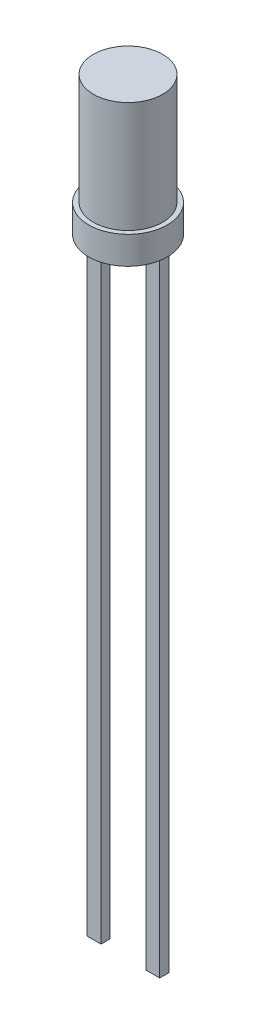
ISO-10303-21;
HEADER;
FILE_DESCRIPTION(('STEP AP214'),'2;1');
FILE_NAME('part.step','',(''),(''),'','','');
FILE_SCHEMA(('AUTOMOTIVE_DESIGN { 1 0 10303 214 1 1 1 1 }'));
ENDSEC;
DATA;
#1=APPLICATION_CONTEXT('core data for automotive mechanical design processes');
#2=APPLICATION_PROTOCOL_DEFINITION('international standard','automotive_design',2000,#1);
#3=PRODUCT_CONTEXT('',#1,'mechanical');
#4=PRODUCT('Part','Part','',(#3));
#5=PRODUCT_RELATED_PRODUCT_CATEGORY('part','',(#4));
#6=PRODUCT_DEFINITION_FORMATION('','',#4);
#7=PRODUCT_DEFINITION_CONTEXT('part definition',#1,'design');
#8=PRODUCT_DEFINITION('design','',#6,#7);
#9=PRODUCT_DEFINITION_SHAPE('','',#8);
#10=(LENGTH_UNIT() NAMED_UNIT(*) SI_UNIT(.MILLI.,.METRE.));
#11=(NAMED_UNIT(*) PLANE_ANGLE_UNIT() SI_UNIT($,.RADIAN.));
#12=(NAMED_UNIT(*) SI_UNIT($,.STERADIAN.) SOLID_ANGLE_UNIT());
#13=UNCERTAINTY_MEASURE_WITH_UNIT(LENGTH_MEASURE(1.E-05),#10,'distance_accuracy_value','');
#14=(GEOMETRIC_REPRESENTATION_CONTEXT(3) GLOBAL_UNCERTAINTY_ASSIGNED_CONTEXT((#13)) GLOBAL_UNIT_ASSIGNED_CONTEXT((#10,
#11,#12)) REPRESENTATION_CONTEXT('',''));
#15=CARTESIAN_POINT('',(0.,0.,0.));
#16=DIRECTION('',(0.,0.,1.));
#17=DIRECTION('',(1.,0.,0.));
#18=AXIS2_PLACEMENT_3D('',#15,#16,#17);
#19=CARTESIAN_POINT('',(0.,-6.,0.));
#20=DIRECTION('',(0.,-1.,0.));
#21=DIRECTION('',(0.,0.,-1.));
#22=AXIS2_PLACEMENT_3D('',#19,#20,#21);
#23=PLANE('',#22);
#24=CARTESIAN_POINT('',(0.,-6.,0.));
#25=DIRECTION('',(0.,-1.,0.));
#26=DIRECTION('',(0.,0.,-1.));
#27=AXIS2_PLACEMENT_3D('',#24,#25,#26);
#28=CIRCLE('',#27,1.7);
#29=CARTESIAN_POINT('',(0.,-6.,-1.7));
#30=VERTEX_POINT('',#29);
#31=EDGE_CURVE('E158',#30,#30,#28,.T.);
#32=ORIENTED_EDGE('',*,*,#31,.T.);
#33=EDGE_LOOP('',(#32));
#34=FACE_BOUND('',#33,.T.);
#35=DIRECTION('',(-1.,0.,0.));
#36=VECTOR('',#35,1.);
#37=CARTESIAN_POINT('',(-1.57,-6.,0.2));
#38=LINE('',#37,#36);
#39=CARTESIAN_POINT('',(-0.97,-6.,0.2));
#40=VERTEX_POINT('',#39);
#41=CARTESIAN_POINT('',(-1.57,-6.,0.2));
#42=VERTEX_POINT('',#41);
#43=EDGE_CURVE('E129',#40,#42,#38,.T.);
#44=ORIENTED_EDGE('',*,*,#43,.F.);
#45=DIRECTION('',(0.,0.,1.));
#46=VECTOR('',#45,1.);
#47=CARTESIAN_POINT('',(-0.97,-6.,0.2));
#48=LINE('',#47,#46);
#49=CARTESIAN_POINT('',(-0.97,-6.,-0.2));
#50=VERTEX_POINT('',#49);
#51=EDGE_CURVE('E126',#50,#40,#48,.T.);
#52=ORIENTED_EDGE('',*,*,#51,.F.);
#53=DIRECTION('',(1.,0.,0.));
#54=VECTOR('',#53,1.);
#55=CARTESIAN_POINT('',(-1.57,-6.,-0.2));
#56=LINE('',#55,#54);
#57=CARTESIAN_POINT('',(-1.57,-6.,-0.2));
#58=VERTEX_POINT('',#57);
#59=EDGE_CURVE('E138',#58,#50,#56,.T.);
#60=ORIENTED_EDGE('',*,*,#59,.F.);
#61=DIRECTION('',(0.,0.,-1.));
#62=VECTOR('',#61,1.);
#63=CARTESIAN_POINT('',(-1.57,-6.,0.2));
#64=LINE('',#63,#62);
#65=EDGE_CURVE('E146',#42,#58,#64,.T.);
#66=ORIENTED_EDGE('',*,*,#65,.F.);
#67=EDGE_LOOP('',(#44,#52,#60,#66));
#68=FACE_BOUND('',#67,.T.);
#69=DIRECTION('',(-1.,0.,0.));
#70=VECTOR('',#69,1.);
#71=CARTESIAN_POINT('',(0.97,-6.,0.2));
#72=LINE('',#71,#70);
#73=CARTESIAN_POINT('',(1.57,-6.,0.2));
#74=VERTEX_POINT('',#73);
#75=CARTESIAN_POINT('',(0.97,-6.,0.2));
#76=VERTEX_POINT('',#75);
#77=EDGE_CURVE('E325',#74,#76,#72,.T.);
#78=ORIENTED_EDGE('',*,*,#77,.F.);
#79=DIRECTION('',(0.,0.,1.));
#80=VECTOR('',#79,1.);
#81=CARTESIAN_POINT('',(1.57,-6.,0.2));
#82=LINE('',#81,#80);
#83=CARTESIAN_POINT('',(1.57,-6.,-0.2));
#84=VERTEX_POINT('',#83);
#85=EDGE_CURVE('E124',#84,#74,#82,.T.);
#86=ORIENTED_EDGE('',*,*,#85,.F.);
#87=DIRECTION('',(1.,0.,0.));
#88=VECTOR('',#87,1.);
#89=CARTESIAN_POINT('',(0.97,-6.,-0.2));
#90=LINE('',#89,#88);
#91=CARTESIAN_POINT('',(0.97,-6.,-0.2));
#92=VERTEX_POINT('',#91);
#93=EDGE_CURVE('E120',#92,#84,#90,.T.);
#94=ORIENTED_EDGE('',*,*,#93,.F.);
#95=DIRECTION('',(0.,0.,-1.));
#96=VECTOR('',#95,1.);
#97=CARTESIAN_POINT('',(0.97,-6.,0.2));
#98=LINE('',#97,#96);
#99=EDGE_CURVE('E322',#76,#92,#98,.T.);
#100=ORIENTED_EDGE('',*,*,#99,.F.);
#101=EDGE_LOOP('',(#78,#86,#94,#100));
#102=FACE_BOUND('',#101,.T.);
#103=ADVANCED_FACE('F35',(#34,#68,#102),#23,.T.);
#104=CARTESIAN_POINT('',(0.,-4.8,0.));
#105=DIRECTION('',(0.,1.,0.));
#106=DIRECTION('',(0.,0.,1.));
#107=AXIS2_PLACEMENT_3D('',#104,#105,#106);
#108=CYLINDRICAL_SURFACE('',#107,1.5);
#109=CARTESIAN_POINT('',(0.,-4.8,0.));
#110=DIRECTION('',(0.,1.,0.));
#111=DIRECTION('',(0.,0.,1.));
#112=AXIS2_PLACEMENT_3D('',#109,#110,#111);
#113=CIRCLE('',#112,1.5);
#114=CARTESIAN_POINT('',(0.,-4.8,1.5));
#115=VERTEX_POINT('',#114);
#116=EDGE_CURVE('E43',#115,#115,#113,.T.);
#117=ORIENTED_EDGE('',*,*,#116,.T.);
#118=EDGE_LOOP('',(#117));
#119=FACE_BOUND('',#118,.T.);
#120=CARTESIAN_POINT('',(0.,0.,0.));
#121=DIRECTION('',(0.,1.,0.));
#122=DIRECTION('',(0.,0.,1.));
#123=AXIS2_PLACEMENT_3D('',#120,#121,#122);
#124=CIRCLE('',#123,1.5);
#125=CARTESIAN_POINT('',(0.,0.,1.5));
#126=VERTEX_POINT('',#125);
#127=EDGE_CURVE('E11',#126,#126,#124,.T.);
#128=ORIENTED_EDGE('',*,*,#127,.F.);
#129=EDGE_LOOP('',(#128));
#130=FACE_BOUND('',#129,.T.);
#131=ADVANCED_FACE('F37',(#119,#130),#108,.T.);
#132=CARTESIAN_POINT('',(0.,0.,0.));
#133=DIRECTION('',(0.,1.,0.));
#134=DIRECTION('',(0.,0.,1.));
#135=AXIS2_PLACEMENT_3D('',#132,#133,#134);
#136=PLANE('',#135);
#137=ORIENTED_EDGE('',*,*,#127,.T.);
#138=EDGE_LOOP('',(#137));
#139=FACE_BOUND('',#138,.T.);
#140=ADVANCED_FACE('F176',(#139),#136,.T.);
#141=CARTESIAN_POINT('',(0.,-6.,0.));
#142=DIRECTION('',(0.,1.,0.));
#143=DIRECTION('',(0.,0.,1.));
#144=AXIS2_PLACEMENT_3D('',#141,#142,#143);
#145=CYLINDRICAL_SURFACE('',#144,1.7);
#146=ORIENTED_EDGE('',*,*,#31,.F.);
#147=EDGE_LOOP('',(#146));
#148=FACE_BOUND('',#147,.T.);
#149=CARTESIAN_POINT('',(0.,-4.8,0.));
#150=DIRECTION('',(0.,-1.,0.));
#151=DIRECTION('',(0.,0.,-1.));
#152=AXIS2_PLACEMENT_3D('',#149,#150,#151);
#153=CIRCLE('',#152,1.7);
#154=CARTESIAN_POINT('',(0.,-4.8,-1.7));
#155=VERTEX_POINT('',#154);
#156=EDGE_CURVE('E157',#155,#155,#153,.T.);
#157=ORIENTED_EDGE('',*,*,#156,.T.);
#158=EDGE_LOOP('',(#157));
#159=FACE_BOUND('',#158,.T.);
#160=ADVANCED_FACE('F171',(#148,#159),#145,.T.);
#161=CARTESIAN_POINT('',(0.,-4.8,0.));
#162=DIRECTION('',(0.,-1.,0.));
#163=DIRECTION('',(0.,0.,-1.));
#164=AXIS2_PLACEMENT_3D('',#161,#162,#163);
#165=PLANE('',#164);
#166=ORIENTED_EDGE('',*,*,#116,.F.);
#167=EDGE_LOOP('',(#166));
#168=FACE_BOUND('',#167,.T.);
#169=ORIENTED_EDGE('',*,*,#156,.F.);
#170=EDGE_LOOP('',(#169));
#171=FACE_BOUND('',#170,.T.);
#172=ADVANCED_FACE('F167',(#168,#171),#165,.F.);
#173=CARTESIAN_POINT('',(-0.97,-33.,0.2));
#174=DIRECTION('',(-1.,0.,0.));
#175=DIRECTION('',(0.,0.,1.));
#176=AXIS2_PLACEMENT_3D('',#173,#174,#175);
#177=PLANE('',#176);
#178=ORIENTED_EDGE('',*,*,#51,.T.);
#179=DIRECTION('',(0.,1.,0.));
#180=VECTOR('',#179,1.);
#181=CARTESIAN_POINT('',(-0.97,-33.,0.2));
#182=LINE('',#181,#180);
#183=CARTESIAN_POINT('',(-0.97,-33.,0.2));
#184=VERTEX_POINT('',#183);
#185=EDGE_CURVE('E155',#184,#40,#182,.T.);
#186=ORIENTED_EDGE('',*,*,#185,.F.);
#187=DIRECTION('',(0.,0.,1.));
#188=VECTOR('',#187,1.);
#189=CARTESIAN_POINT('',(-0.97,-33.,0.2));
#190=LINE('',#189,#188);
#191=CARTESIAN_POINT('',(-0.97,-33.,-0.2));
#192=VERTEX_POINT('',#191);
#193=EDGE_CURVE('E134',#192,#184,#190,.T.);
#194=ORIENTED_EDGE('',*,*,#193,.F.);
#195=DIRECTION('',(0.,1.,0.));
#196=VECTOR('',#195,1.);
#197=CARTESIAN_POINT('',(-0.97,-33.,-0.2));
#198=LINE('',#197,#196);
#199=EDGE_CURVE('E143',#192,#50,#198,.T.);
#200=ORIENTED_EDGE('',*,*,#199,.T.);
#201=EDGE_LOOP('',(#178,#186,#194,#200));
#202=FACE_BOUND('',#201,.T.);
#203=ADVANCED_FACE('F170',(#202),#177,.F.);
#204=CARTESIAN_POINT('',(-1.57,-33.,0.2));
#205=DIRECTION('',(0.,0.,-1.));
#206=DIRECTION('',(-1.,0.,0.));
#207=AXIS2_PLACEMENT_3D('',#204,#205,#206);
#208=PLANE('',#207);
#209=ORIENTED_EDGE('',*,*,#43,.T.);
#210=DIRECTION('',(0.,1.,0.));
#211=VECTOR('',#210,1.);
#212=CARTESIAN_POINT('',(-1.57,-33.,0.2));
#213=LINE('',#212,#211);
#214=CARTESIAN_POINT('',(-1.57,-33.,0.2));
#215=VERTEX_POINT('',#214);
#216=EDGE_CURVE('E152',#215,#42,#213,.T.);
#217=ORIENTED_EDGE('',*,*,#216,.F.);
#218=DIRECTION('',(-1.,0.,0.));
#219=VECTOR('',#218,1.);
#220=CARTESIAN_POINT('',(-1.57,-33.,0.2));
#221=LINE('',#220,#219);
#222=EDGE_CURVE('E137',#184,#215,#221,.T.);
#223=ORIENTED_EDGE('',*,*,#222,.F.);
#224=ORIENTED_EDGE('',*,*,#185,.T.);
#225=EDGE_LOOP('',(#209,#217,#223,#224));
#226=FACE_BOUND('',#225,.T.);
#227=ADVANCED_FACE('F194',(#226),#208,.F.);
#228=CARTESIAN_POINT('',(-1.57,-33.,0.2));
#229=DIRECTION('',(1.,0.,0.));
#230=DIRECTION('',(0.,0.,-1.));
#231=AXIS2_PLACEMENT_3D('',#228,#229,#230);
#232=PLANE('',#231);
#233=ORIENTED_EDGE('',*,*,#65,.T.);
#234=DIRECTION('',(0.,1.,0.));
#235=VECTOR('',#234,1.);
#236=CARTESIAN_POINT('',(-1.57,-33.,-0.2));
#237=LINE('',#236,#235);
#238=CARTESIAN_POINT('',(-1.57,-33.,-0.2));
#239=VERTEX_POINT('',#238);
#240=EDGE_CURVE('E58',#239,#58,#237,.T.);
#241=ORIENTED_EDGE('',*,*,#240,.F.);
#242=DIRECTION('',(0.,0.,-1.));
#243=VECTOR('',#242,1.);
#244=CARTESIAN_POINT('',(-1.57,-33.,0.2));
#245=LINE('',#244,#243);
#246=EDGE_CURVE('E140',#215,#239,#245,.T.);
#247=ORIENTED_EDGE('',*,*,#246,.F.);
#248=ORIENTED_EDGE('',*,*,#216,.T.);
#249=EDGE_LOOP('',(#233,#241,#247,#248));
#250=FACE_BOUND('',#249,.T.);
#251=ADVANCED_FACE('F198',(#250),#232,.F.);
#252=CARTESIAN_POINT('',(-1.57,-33.,-0.2));
#253=DIRECTION('',(0.,0.,1.));
#254=DIRECTION('',(1.,0.,0.));
#255=AXIS2_PLACEMENT_3D('',#252,#253,#254);
#256=PLANE('',#255);
#257=ORIENTED_EDGE('',*,*,#59,.T.);
#258=ORIENTED_EDGE('',*,*,#199,.F.);
#259=DIRECTION('',(1.,0.,0.));
#260=VECTOR('',#259,1.);
#261=CARTESIAN_POINT('',(-1.57,-33.,-0.2));
#262=LINE('',#261,#260);
#263=EDGE_CURVE('E142',#239,#192,#262,.T.);
#264=ORIENTED_EDGE('',*,*,#263,.F.);
#265=ORIENTED_EDGE('',*,*,#240,.T.);
#266=EDGE_LOOP('',(#257,#258,#264,#265));
#267=FACE_BOUND('',#266,.T.);
#268=ADVANCED_FACE('F202',(#267),#256,.F.);
#269=CARTESIAN_POINT('',(0.,-33.,0.));
#270=DIRECTION('',(0.,-1.,0.));
#271=DIRECTION('',(0.,0.,-1.));
#272=AXIS2_PLACEMENT_3D('',#269,#270,#271);
#273=PLANE('',#272);
#274=ORIENTED_EDGE('',*,*,#193,.T.);
#275=ORIENTED_EDGE('',*,*,#222,.T.);
#276=ORIENTED_EDGE('',*,*,#246,.T.);
#277=ORIENTED_EDGE('',*,*,#263,.T.);
#278=EDGE_LOOP('',(#274,#275,#276,#277));
#279=FACE_BOUND('',#278,.T.);
#280=ADVANCED_FACE('F206',(#279),#273,.T.);
#281=CARTESIAN_POINT('',(1.57,-33.,0.2));
#282=DIRECTION('',(-1.,0.,0.));
#283=DIRECTION('',(0.,0.,1.));
#284=AXIS2_PLACEMENT_3D('',#281,#282,#283);
#285=PLANE('',#284);
#286=ORIENTED_EDGE('',*,*,#85,.T.);
#287=DIRECTION('',(0.,1.,0.));
#288=VECTOR('',#287,1.);
#289=CARTESIAN_POINT('',(1.57,-33.,0.2));
#290=LINE('',#289,#288);
#291=CARTESIAN_POINT('',(1.57,-33.,0.2));
#292=VERTEX_POINT('',#291);
#293=EDGE_CURVE('E105',#292,#74,#290,.T.);
#294=ORIENTED_EDGE('',*,*,#293,.F.);
#295=DIRECTION('',(0.,0.,1.));
#296=VECTOR('',#295,1.);
#297=CARTESIAN_POINT('',(1.57,-33.,0.2));
#298=LINE('',#297,#296);
#299=CARTESIAN_POINT('',(1.57,-33.,-0.2));
#300=VERTEX_POINT('',#299);
#301=EDGE_CURVE('E112',#300,#292,#298,.T.);
#302=ORIENTED_EDGE('',*,*,#301,.F.);
#303=DIRECTION('',(0.,1.,0.));
#304=VECTOR('',#303,1.);
#305=CARTESIAN_POINT('',(1.57,-33.,-0.2));
#306=LINE('',#305,#304);
#307=EDGE_CURVE('E319',#300,#84,#306,.T.);
#308=ORIENTED_EDGE('',*,*,#307,.T.);
#309=EDGE_LOOP('',(#286,#294,#302,#308));
#310=FACE_BOUND('',#309,.T.);
#311=ADVANCED_FACE('F122',(#310),#285,.F.);
#312=CARTESIAN_POINT('',(0.97,-33.,0.2));
#313=DIRECTION('',(0.,0.,-1.));
#314=DIRECTION('',(-1.,0.,0.));
#315=AXIS2_PLACEMENT_3D('',#312,#313,#314);
#316=PLANE('',#315);
#317=ORIENTED_EDGE('',*,*,#77,.T.);
#318=DIRECTION('',(0.,1.,0.));
#319=VECTOR('',#318,1.);
#320=CARTESIAN_POINT('',(0.97,-33.,0.2));
#321=LINE('',#320,#319);
#322=CARTESIAN_POINT('',(0.97,-33.,0.2));
#323=VERTEX_POINT('',#322);
#324=EDGE_CURVE('E108',#323,#76,#321,.T.);
#325=ORIENTED_EDGE('',*,*,#324,.F.);
#326=DIRECTION('',(-1.,0.,0.));
#327=VECTOR('',#326,1.);
#328=CARTESIAN_POINT('',(0.97,-33.,0.2));
#329=LINE('',#328,#327);
#330=EDGE_CURVE('E101',#292,#323,#329,.T.);
#331=ORIENTED_EDGE('',*,*,#330,.F.);
#332=ORIENTED_EDGE('',*,*,#293,.T.);
#333=EDGE_LOOP('',(#317,#325,#331,#332));
#334=FACE_BOUND('',#333,.T.);
#335=ADVANCED_FACE('F103',(#334),#316,.F.);
#336=CARTESIAN_POINT('',(0.97,-33.,0.2));
#337=DIRECTION('',(1.,0.,0.));
#338=DIRECTION('',(0.,0.,-1.));
#339=AXIS2_PLACEMENT_3D('',#336,#337,#338);
#340=PLANE('',#339);
#341=ORIENTED_EDGE('',*,*,#99,.T.);
#342=DIRECTION('',(0.,1.,0.));
#343=VECTOR('',#342,1.);
#344=CARTESIAN_POINT('',(0.97,-33.,-0.2));
#345=LINE('',#344,#343);
#346=CARTESIAN_POINT('',(0.97,-33.,-0.2));
#347=VERTEX_POINT('',#346);
#348=EDGE_CURVE('E50',#347,#92,#345,.T.);
#349=ORIENTED_EDGE('',*,*,#348,.F.);
#350=DIRECTION('',(0.,0.,-1.));
#351=VECTOR('',#350,1.);
#352=CARTESIAN_POINT('',(0.97,-33.,0.2));
#353=LINE('',#352,#351);
#354=EDGE_CURVE('E111',#323,#347,#353,.T.);
#355=ORIENTED_EDGE('',*,*,#354,.F.);
#356=ORIENTED_EDGE('',*,*,#324,.T.);
#357=EDGE_LOOP('',(#341,#349,#355,#356));
#358=FACE_BOUND('',#357,.T.);
#359=ADVANCED_FACE('F214',(#358),#340,.F.);
#360=CARTESIAN_POINT('',(0.97,-33.,-0.2));
#361=DIRECTION('',(0.,0.,1.));
#362=DIRECTION('',(1.,0.,0.));
#363=AXIS2_PLACEMENT_3D('',#360,#361,#362);
#364=PLANE('',#363);
#365=ORIENTED_EDGE('',*,*,#93,.T.);
#366=ORIENTED_EDGE('',*,*,#307,.F.);
#367=DIRECTION('',(1.,0.,0.));
#368=VECTOR('',#367,1.);
#369=CARTESIAN_POINT('',(0.97,-33.,-0.2));
#370=LINE('',#369,#368);
#371=EDGE_CURVE('E116',#347,#300,#370,.T.);
#372=ORIENTED_EDGE('',*,*,#371,.F.);
#373=ORIENTED_EDGE('',*,*,#348,.T.);
#374=EDGE_LOOP('',(#365,#366,#372,#373));
#375=FACE_BOUND('',#374,.T.);
#376=ADVANCED_FACE('F217',(#375),#364,.F.);
#377=CARTESIAN_POINT('',(0.,-33.,0.));
#378=DIRECTION('',(0.,-1.,0.));
#379=DIRECTION('',(0.,0.,-1.));
#380=AXIS2_PLACEMENT_3D('',#377,#378,#379);
#381=PLANE('',#380);
#382=ORIENTED_EDGE('',*,*,#301,.T.);
#383=ORIENTED_EDGE('',*,*,#330,.T.);
#384=ORIENTED_EDGE('',*,*,#354,.T.);
#385=ORIENTED_EDGE('',*,*,#371,.T.);
#386=EDGE_LOOP('',(#382,#383,#384,#385));
#387=FACE_BOUND('',#386,.T.);
#388=ADVANCED_FACE('F115',(#387),#381,.T.);
#389=CLOSED_SHELL('',(#103,#131,#140,#160,#172,#203,#227,#251,#268,#280,#311,#335,#359,#376,#388));
#390=MANIFOLD_SOLID_BREP('B2',#389);
#391=ADVANCED_BREP_SHAPE_REPRESENTATION('',(#18,#390),#14);
#392=SHAPE_DEFINITION_REPRESENTATION(#9,#391);
ENDSEC;
END-ISO-10303-21;
